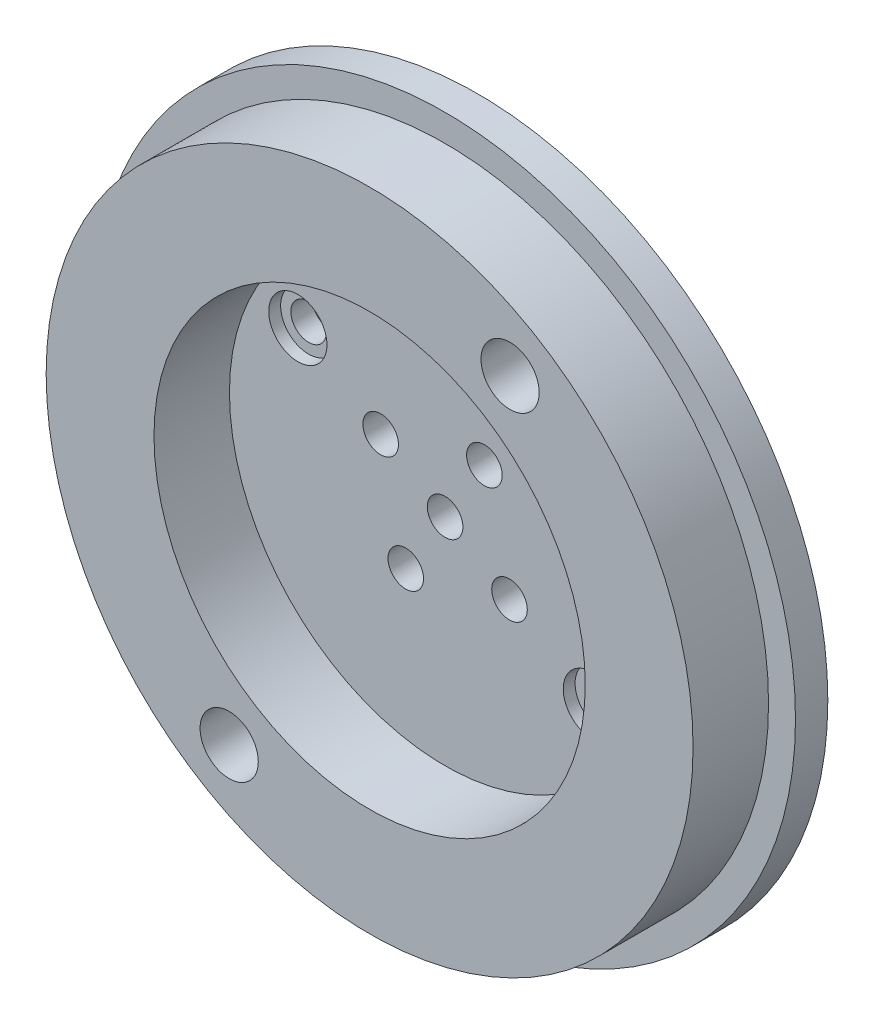
ISO-10303-21;
HEADER;
FILE_DESCRIPTION(('STEP AP214'),'2;1');
FILE_NAME('part.step','',(''),(''),'','','');
FILE_SCHEMA(('AUTOMOTIVE_DESIGN { 1 0 10303 214 1 1 1 1 }'));
ENDSEC;
DATA;
#1=APPLICATION_CONTEXT('core data for automotive mechanical design processes');
#2=APPLICATION_PROTOCOL_DEFINITION('international standard','automotive_design',2000,#1);
#3=PRODUCT_CONTEXT('',#1,'mechanical');
#4=PRODUCT('Part','Part','',(#3));
#5=PRODUCT_RELATED_PRODUCT_CATEGORY('part','',(#4));
#6=PRODUCT_DEFINITION_FORMATION('','',#4);
#7=PRODUCT_DEFINITION_CONTEXT('part definition',#1,'design');
#8=PRODUCT_DEFINITION('design','',#6,#7);
#9=PRODUCT_DEFINITION_SHAPE('','',#8);
#10=(LENGTH_UNIT() NAMED_UNIT(*) SI_UNIT(.MILLI.,.METRE.));
#11=(NAMED_UNIT(*) PLANE_ANGLE_UNIT() SI_UNIT($,.RADIAN.));
#12=(NAMED_UNIT(*) SI_UNIT($,.STERADIAN.) SOLID_ANGLE_UNIT());
#13=UNCERTAINTY_MEASURE_WITH_UNIT(LENGTH_MEASURE(1.E-05),#10,'distance_accuracy_value','');
#14=(GEOMETRIC_REPRESENTATION_CONTEXT(3) GLOBAL_UNCERTAINTY_ASSIGNED_CONTEXT((#13)) GLOBAL_UNIT_ASSIGNED_CONTEXT((#10,
#11,#12)) REPRESENTATION_CONTEXT('',''));
#15=CARTESIAN_POINT('',(0.,0.,0.));
#16=DIRECTION('',(0.,0.,1.));
#17=DIRECTION('',(1.,0.,0.));
#18=AXIS2_PLACEMENT_3D('',#15,#16,#17);
#19=CARTESIAN_POINT('',(-13.656264528531,8.33705218448303,2.));
#20=DIRECTION('',(0.,0.,-1.));
#21=DIRECTION('',(-1.,0.,0.));
#22=AXIS2_PLACEMENT_3D('',#19,#20,#21);
#23=CYLINDRICAL_SURFACE('',#22,2.6);
#24=CARTESIAN_POINT('',(-13.656264528531,8.33705218448303,2.));
#25=DIRECTION('',(0.,0.,-1.));
#26=DIRECTION('',(-1.,0.,0.));
#27=AXIS2_PLACEMENT_3D('',#24,#25,#26);
#28=CIRCLE('',#27,2.6);
#29=CARTESIAN_POINT('',(-16.256264528531,8.33705218448303,2.));
#30=VERTEX_POINT('',#29);
#31=EDGE_CURVE('E61',#30,#30,#28,.T.);
#32=ORIENTED_EDGE('',*,*,#31,.T.);
#33=EDGE_LOOP('',(#32));
#34=FACE_BOUND('',#33,.T.);
#35=CARTESIAN_POINT('',(-13.656264528531,8.33705218448303,0.));
#36=DIRECTION('',(0.,0.,-1.));
#37=DIRECTION('',(-1.,0.,0.));
#38=AXIS2_PLACEMENT_3D('',#35,#36,#37);
#39=CIRCLE('',#38,2.6);
#40=CARTESIAN_POINT('',(-16.256264528531,8.33705218448303,0.));
#41=VERTEX_POINT('',#40);
#42=EDGE_CURVE('E59',#41,#41,#39,.T.);
#43=ORIENTED_EDGE('',*,*,#42,.F.);
#44=EDGE_LOOP('',(#43));
#45=FACE_BOUND('',#44,.T.);
#46=ADVANCED_FACE('F48',(#34,#45),#23,.T.);
#47=CARTESIAN_POINT('',(-13.656264528531,8.33705218448303,2.));
#48=DIRECTION('',(0.,0.,-1.));
#49=DIRECTION('',(-1.,0.,0.));
#50=AXIS2_PLACEMENT_3D('',#47,#48,#49);
#51=PLANE('',#50);
#52=CARTESIAN_POINT('',(-13.656264528531,8.33705218448303,2.));
#53=DIRECTION('',(0.,0.,-1.));
#54=DIRECTION('',(-1.,0.,0.));
#55=AXIS2_PLACEMENT_3D('',#52,#53,#54);
#56=CIRCLE('',#55,1.65000000000001);
#57=CARTESIAN_POINT('',(-15.3062645285311,8.33705218448303,2.));
#58=VERTEX_POINT('',#57);
#59=EDGE_CURVE('E52',#58,#58,#56,.T.);
#60=ORIENTED_EDGE('',*,*,#59,.T.);
#61=EDGE_LOOP('',(#60));
#62=FACE_BOUND('',#61,.T.);
#63=ORIENTED_EDGE('',*,*,#31,.F.);
#64=EDGE_LOOP('',(#63));
#65=FACE_BOUND('',#64,.T.);
#66=ADVANCED_FACE('F70',(#62,#65),#51,.F.);
#67=CARTESIAN_POINT('',(-13.656264528531,8.33705218448303,0.));
#68=DIRECTION('',(0.,0.,-1.));
#69=DIRECTION('',(-1.,0.,0.));
#70=AXIS2_PLACEMENT_3D('',#67,#68,#69);
#71=PLANE('',#70);
#72=CARTESIAN_POINT('',(-13.656264528531,8.33705218448303,0.));
#73=DIRECTION('',(0.,0.,-1.));
#74=DIRECTION('',(-1.,0.,0.));
#75=AXIS2_PLACEMENT_3D('',#72,#73,#74);
#76=CIRCLE('',#75,1.65000000000001);
#77=CARTESIAN_POINT('',(-15.3062645285311,8.33705218448303,0.));
#78=VERTEX_POINT('',#77);
#79=EDGE_CURVE('E11',#78,#78,#76,.T.);
#80=ORIENTED_EDGE('',*,*,#79,.F.);
#81=EDGE_LOOP('',(#80));
#82=FACE_BOUND('',#81,.T.);
#83=ORIENTED_EDGE('',*,*,#42,.T.);
#84=EDGE_LOOP('',(#83));
#85=FACE_BOUND('',#84,.T.);
#86=ADVANCED_FACE('F67',(#82,#85),#71,.T.);
#87=CARTESIAN_POINT('',(-13.656264528531,8.33705218448303,2.));
#88=DIRECTION('',(0.,0.,-1.));
#89=DIRECTION('',(-1.,0.,0.));
#90=AXIS2_PLACEMENT_3D('',#87,#88,#89);
#91=CYLINDRICAL_SURFACE('',#90,1.65000000000001);
#92=ORIENTED_EDGE('',*,*,#59,.F.);
#93=EDGE_LOOP('',(#92));
#94=FACE_BOUND('',#93,.T.);
#95=ORIENTED_EDGE('',*,*,#79,.T.);
#96=EDGE_LOOP('',(#95));
#97=FACE_BOUND('',#96,.T.);
#98=ADVANCED_FACE('F50',(#94,#97),#91,.F.);
#99=CLOSED_SHELL('',(#46,#66,#86,#98));
#100=MANIFOLD_SOLID_BREP('B2',#99);
#101=CARTESIAN_POINT('',(13.6562645285306,-8.33705218448268,2.));
#102=DIRECTION('',(0.,0.,-1.));
#103=DIRECTION('',(-1.,0.,0.));
#104=AXIS2_PLACEMENT_3D('',#101,#102,#103);
#105=CYLINDRICAL_SURFACE('',#104,2.6);
#106=CARTESIAN_POINT('',(13.6562645285306,-8.33705218448268,2.));
#107=DIRECTION('',(0.,0.,-1.));
#108=DIRECTION('',(-1.,0.,0.));
#109=AXIS2_PLACEMENT_3D('',#106,#107,#108);
#110=CIRCLE('',#109,2.6);
#111=CARTESIAN_POINT('',(11.0562645285306,-8.33705218448268,2.));
#112=VERTEX_POINT('',#111);
#113=EDGE_CURVE('E131',#112,#112,#110,.T.);
#114=ORIENTED_EDGE('',*,*,#113,.T.);
#115=EDGE_LOOP('',(#114));
#116=FACE_BOUND('',#115,.T.);
#117=CARTESIAN_POINT('',(13.6562645285306,-8.33705218448268,0.));
#118=DIRECTION('',(0.,0.,-1.));
#119=DIRECTION('',(-1.,0.,0.));
#120=AXIS2_PLACEMENT_3D('',#117,#118,#119);
#121=CIRCLE('',#120,2.6);
#122=CARTESIAN_POINT('',(11.0562645285306,-8.33705218448268,0.));
#123=VERTEX_POINT('',#122);
#124=EDGE_CURVE('E129',#123,#123,#121,.T.);
#125=ORIENTED_EDGE('',*,*,#124,.F.);
#126=EDGE_LOOP('',(#125));
#127=FACE_BOUND('',#126,.T.);
#128=ADVANCED_FACE('F118',(#116,#127),#105,.T.);
#129=CARTESIAN_POINT('',(13.6562645285306,-8.33705218448268,2.));
#130=DIRECTION('',(0.,0.,-1.));
#131=DIRECTION('',(-1.,0.,0.));
#132=AXIS2_PLACEMENT_3D('',#129,#130,#131);
#133=PLANE('',#132);
#134=CARTESIAN_POINT('',(13.6562645285306,-8.33705218448268,2.));
#135=DIRECTION('',(0.,0.,-1.));
#136=DIRECTION('',(-1.,0.,0.));
#137=AXIS2_PLACEMENT_3D('',#134,#135,#136);
#138=CIRCLE('',#137,1.65);
#139=CARTESIAN_POINT('',(12.0062645285306,-8.33705218448268,2.));
#140=VERTEX_POINT('',#139);
#141=EDGE_CURVE('E122',#140,#140,#138,.T.);
#142=ORIENTED_EDGE('',*,*,#141,.T.);
#143=EDGE_LOOP('',(#142));
#144=FACE_BOUND('',#143,.T.);
#145=ORIENTED_EDGE('',*,*,#113,.F.);
#146=EDGE_LOOP('',(#145));
#147=FACE_BOUND('',#146,.T.);
#148=ADVANCED_FACE('F140',(#144,#147),#133,.F.);
#149=CARTESIAN_POINT('',(13.6562645285306,-8.33705218448268,0.));
#150=DIRECTION('',(0.,0.,-1.));
#151=DIRECTION('',(-1.,0.,0.));
#152=AXIS2_PLACEMENT_3D('',#149,#150,#151);
#153=PLANE('',#152);
#154=CARTESIAN_POINT('',(13.6562645285306,-8.33705218448268,0.));
#155=DIRECTION('',(0.,0.,-1.));
#156=DIRECTION('',(-1.,0.,0.));
#157=AXIS2_PLACEMENT_3D('',#154,#155,#156);
#158=CIRCLE('',#157,1.65);
#159=CARTESIAN_POINT('',(12.0062645285306,-8.33705218448268,0.));
#160=VERTEX_POINT('',#159);
#161=EDGE_CURVE('E47',#160,#160,#158,.T.);
#162=ORIENTED_EDGE('',*,*,#161,.F.);
#163=EDGE_LOOP('',(#162));
#164=FACE_BOUND('',#163,.T.);
#165=ORIENTED_EDGE('',*,*,#124,.T.);
#166=EDGE_LOOP('',(#165));
#167=FACE_BOUND('',#166,.T.);
#168=ADVANCED_FACE('F137',(#164,#167),#153,.T.);
#169=CARTESIAN_POINT('',(13.6562645285306,-8.33705218448268,2.));
#170=DIRECTION('',(0.,0.,-1.));
#171=DIRECTION('',(-1.,0.,0.));
#172=AXIS2_PLACEMENT_3D('',#169,#170,#171);
#173=CYLINDRICAL_SURFACE('',#172,1.65);
#174=ORIENTED_EDGE('',*,*,#141,.F.);
#175=EDGE_LOOP('',(#174));
#176=FACE_BOUND('',#175,.T.);
#177=ORIENTED_EDGE('',*,*,#161,.T.);
#178=EDGE_LOOP('',(#177));
#179=FACE_BOUND('',#178,.T.);
#180=ADVANCED_FACE('F120',(#176,#179),#173,.F.);
#181=CLOSED_SHELL('',(#128,#148,#168,#180));
#182=MANIFOLD_SOLID_BREP('B6',#181);
#183=CARTESIAN_POINT('',(13.0255759573381,21.3361637871199,2.));
#184=DIRECTION('',(0.,0.,-1.));
#185=DIRECTION('',(-1.,0.,0.));
#186=AXIS2_PLACEMENT_3D('',#183,#184,#185);
#187=CYLINDRICAL_SURFACE('',#186,2.6);
#188=CARTESIAN_POINT('',(13.0255759573381,21.3361637871199,2.));
#189=DIRECTION('',(0.,0.,-1.));
#190=DIRECTION('',(-1.,0.,0.));
#191=AXIS2_PLACEMENT_3D('',#188,#189,#190);
#192=CIRCLE('',#191,2.6);
#193=CARTESIAN_POINT('',(10.4255759573381,21.3361637871199,2.));
#194=VERTEX_POINT('',#193);
#195=EDGE_CURVE('E201',#194,#194,#192,.T.);
#196=ORIENTED_EDGE('',*,*,#195,.T.);
#197=EDGE_LOOP('',(#196));
#198=FACE_BOUND('',#197,.T.);
#199=CARTESIAN_POINT('',(13.0255759573381,21.3361637871199,0.));
#200=DIRECTION('',(0.,0.,-1.));
#201=DIRECTION('',(-1.,0.,0.));
#202=AXIS2_PLACEMENT_3D('',#199,#200,#201);
#203=CIRCLE('',#202,2.6);
#204=CARTESIAN_POINT('',(10.4255759573381,21.3361637871199,0.));
#205=VERTEX_POINT('',#204);
#206=EDGE_CURVE('E199',#205,#205,#203,.T.);
#207=ORIENTED_EDGE('',*,*,#206,.F.);
#208=EDGE_LOOP('',(#207));
#209=FACE_BOUND('',#208,.T.);
#210=ADVANCED_FACE('F188',(#198,#209),#187,.T.);
#211=CARTESIAN_POINT('',(13.0255759573381,21.3361637871199,2.));
#212=DIRECTION('',(0.,0.,-1.));
#213=DIRECTION('',(-1.,0.,0.));
#214=AXIS2_PLACEMENT_3D('',#211,#212,#213);
#215=PLANE('',#214);
#216=CARTESIAN_POINT('',(13.0255759573381,21.3361637871199,2.));
#217=DIRECTION('',(0.,0.,-1.));
#218=DIRECTION('',(-1.,0.,0.));
#219=AXIS2_PLACEMENT_3D('',#216,#217,#218);
#220=CIRCLE('',#219,1.65);
#221=CARTESIAN_POINT('',(11.3755759573381,21.3361637871199,2.));
#222=VERTEX_POINT('',#221);
#223=EDGE_CURVE('E192',#222,#222,#220,.T.);
#224=ORIENTED_EDGE('',*,*,#223,.T.);
#225=EDGE_LOOP('',(#224));
#226=FACE_BOUND('',#225,.T.);
#227=ORIENTED_EDGE('',*,*,#195,.F.);
#228=EDGE_LOOP('',(#227));
#229=FACE_BOUND('',#228,.T.);
#230=ADVANCED_FACE('F210',(#226,#229),#215,.F.);
#231=CARTESIAN_POINT('',(13.0255759573381,21.3361637871199,0.));
#232=DIRECTION('',(0.,0.,-1.));
#233=DIRECTION('',(-1.,0.,0.));
#234=AXIS2_PLACEMENT_3D('',#231,#232,#233);
#235=PLANE('',#234);
#236=CARTESIAN_POINT('',(13.0255759573381,21.3361637871199,0.));
#237=DIRECTION('',(0.,0.,-1.));
#238=DIRECTION('',(-1.,0.,0.));
#239=AXIS2_PLACEMENT_3D('',#236,#237,#238);
#240=CIRCLE('',#239,1.65);
#241=CARTESIAN_POINT('',(11.3755759573381,21.3361637871199,0.));
#242=VERTEX_POINT('',#241);
#243=EDGE_CURVE('E117',#242,#242,#240,.T.);
#244=ORIENTED_EDGE('',*,*,#243,.F.);
#245=EDGE_LOOP('',(#244));
#246=FACE_BOUND('',#245,.T.);
#247=ORIENTED_EDGE('',*,*,#206,.T.);
#248=EDGE_LOOP('',(#247));
#249=FACE_BOUND('',#248,.T.);
#250=ADVANCED_FACE('F207',(#246,#249),#235,.T.);
#251=CARTESIAN_POINT('',(13.0255759573381,21.3361637871199,2.));
#252=DIRECTION('',(0.,0.,-1.));
#253=DIRECTION('',(-1.,0.,0.));
#254=AXIS2_PLACEMENT_3D('',#251,#252,#253);
#255=CYLINDRICAL_SURFACE('',#254,1.65);
#256=ORIENTED_EDGE('',*,*,#223,.F.);
#257=EDGE_LOOP('',(#256));
#258=FACE_BOUND('',#257,.T.);
#259=ORIENTED_EDGE('',*,*,#243,.T.);
#260=EDGE_LOOP('',(#259));
#261=FACE_BOUND('',#260,.T.);
#262=ADVANCED_FACE('F190',(#258,#261),#255,.F.);
#263=CLOSED_SHELL('',(#210,#230,#250,#262));
#264=MANIFOLD_SOLID_BREP('B42',#263);
#265=CARTESIAN_POINT('',(-13.0255759573389,-21.3361637871192,2.));
#266=DIRECTION('',(0.,0.,-1.));
#267=DIRECTION('',(-1.,0.,0.));
#268=AXIS2_PLACEMENT_3D('',#265,#266,#267);
#269=CYLINDRICAL_SURFACE('',#268,2.6);
#270=CARTESIAN_POINT('',(-13.0255759573389,-21.3361637871192,2.));
#271=DIRECTION('',(0.,0.,-1.));
#272=DIRECTION('',(-1.,0.,0.));
#273=AXIS2_PLACEMENT_3D('',#270,#271,#272);
#274=CIRCLE('',#273,2.6);
#275=CARTESIAN_POINT('',(-15.6255759573389,-21.3361637871192,2.));
#276=VERTEX_POINT('',#275);
#277=EDGE_CURVE('E187',#276,#276,#274,.T.);
#278=ORIENTED_EDGE('',*,*,#277,.T.);
#279=EDGE_LOOP('',(#278));
#280=FACE_BOUND('',#279,.T.);
#281=CARTESIAN_POINT('',(-13.0255759573389,-21.3361637871192,0.));
#282=DIRECTION('',(0.,0.,-1.));
#283=DIRECTION('',(-1.,0.,0.));
#284=AXIS2_PLACEMENT_3D('',#281,#282,#283);
#285=CIRCLE('',#284,2.6);
#286=CARTESIAN_POINT('',(-15.6255759573389,-21.3361637871192,0.));
#287=VERTEX_POINT('',#286);
#288=EDGE_CURVE('E260',#287,#287,#285,.T.);
#289=ORIENTED_EDGE('',*,*,#288,.F.);
#290=EDGE_LOOP('',(#289));
#291=FACE_BOUND('',#290,.T.);
#292=ADVANCED_FACE('F257',(#280,#291),#269,.T.);
#293=CARTESIAN_POINT('',(-13.0255759573389,-21.3361637871192,2.));
#294=DIRECTION('',(0.,0.,-1.));
#295=DIRECTION('',(-1.,0.,0.));
#296=AXIS2_PLACEMENT_3D('',#293,#294,#295);
#297=PLANE('',#296);
#298=CARTESIAN_POINT('',(-13.0255759573389,-21.3361637871192,2.));
#299=DIRECTION('',(0.,0.,-1.));
#300=DIRECTION('',(-1.,0.,0.));
#301=AXIS2_PLACEMENT_3D('',#298,#299,#300);
#302=CIRCLE('',#301,1.65);
#303=CARTESIAN_POINT('',(-14.6755759573389,-21.3361637871192,2.));
#304=VERTEX_POINT('',#303);
#305=EDGE_CURVE('E267',#304,#304,#302,.T.);
#306=ORIENTED_EDGE('',*,*,#305,.T.);
#307=EDGE_LOOP('',(#306));
#308=FACE_BOUND('',#307,.T.);
#309=ORIENTED_EDGE('',*,*,#277,.F.);
#310=EDGE_LOOP('',(#309));
#311=FACE_BOUND('',#310,.T.);
#312=ADVANCED_FACE('F275',(#308,#311),#297,.F.);
#313=CARTESIAN_POINT('',(-13.0255759573389,-21.3361637871192,0.));
#314=DIRECTION('',(0.,0.,-1.));
#315=DIRECTION('',(-1.,0.,0.));
#316=AXIS2_PLACEMENT_3D('',#313,#314,#315);
#317=PLANE('',#316);
#318=CARTESIAN_POINT('',(-13.0255759573389,-21.3361637871192,0.));
#319=DIRECTION('',(0.,0.,-1.));
#320=DIRECTION('',(-1.,0.,0.));
#321=AXIS2_PLACEMENT_3D('',#318,#319,#320);
#322=CIRCLE('',#321,1.65);
#323=CARTESIAN_POINT('',(-14.6755759573389,-21.3361637871192,0.));
#324=VERTEX_POINT('',#323);
#325=EDGE_CURVE('E269',#324,#324,#322,.T.);
#326=ORIENTED_EDGE('',*,*,#325,.F.);
#327=EDGE_LOOP('',(#326));
#328=FACE_BOUND('',#327,.T.);
#329=ORIENTED_EDGE('',*,*,#288,.T.);
#330=EDGE_LOOP('',(#329));
#331=FACE_BOUND('',#330,.T.);
#332=ADVANCED_FACE('F281',(#328,#331),#317,.T.);
#333=CARTESIAN_POINT('',(-13.0255759573389,-21.3361637871192,2.));
#334=DIRECTION('',(0.,0.,-1.));
#335=DIRECTION('',(-1.,0.,0.));
#336=AXIS2_PLACEMENT_3D('',#333,#334,#335);
#337=CYLINDRICAL_SURFACE('',#336,1.65);
#338=ORIENTED_EDGE('',*,*,#305,.F.);
#339=EDGE_LOOP('',(#338));
#340=FACE_BOUND('',#339,.T.);
#341=ORIENTED_EDGE('',*,*,#325,.T.);
#342=EDGE_LOOP('',(#341));
#343=FACE_BOUND('',#342,.T.);
#344=ADVANCED_FACE('F278',(#340,#343),#337,.F.);
#345=CLOSED_SHELL('',(#292,#312,#332,#344));
#346=MANIFOLD_SOLID_BREP('B112',#345);
#347=CARTESIAN_POINT('',(0.,0.,3.));
#348=DIRECTION('',(0.,0.,-1.));
#349=DIRECTION('',(-1.,0.,0.));
#350=AXIS2_PLACEMENT_3D('',#347,#348,#349);
#351=CYLINDRICAL_SURFACE('',#350,32.5);
#352=CARTESIAN_POINT('',(0.,0.,3.));
#353=DIRECTION('',(0.,0.,1.));
#354=DIRECTION('',(1.,0.,0.));
#355=AXIS2_PLACEMENT_3D('',#352,#353,#354);
#356=CIRCLE('',#355,32.5);
#357=CARTESIAN_POINT('',(32.5,0.,3.));
#358=VERTEX_POINT('',#357);
#359=EDGE_CURVE('E326',#358,#358,#356,.T.);
#360=ORIENTED_EDGE('',*,*,#359,.F.);
#361=EDGE_LOOP('',(#360));
#362=FACE_BOUND('',#361,.T.);
#363=CARTESIAN_POINT('',(0.,0.,0.));
#364=DIRECTION('',(0.,0.,1.));
#365=DIRECTION('',(1.,0.,0.));
#366=AXIS2_PLACEMENT_3D('',#363,#364,#365);
#367=CIRCLE('',#366,32.5);
#368=CARTESIAN_POINT('',(32.5,0.,0.));
#369=VERTEX_POINT('',#368);
#370=EDGE_CURVE('E331',#369,#369,#367,.T.);
#371=ORIENTED_EDGE('',*,*,#370,.T.);
#372=EDGE_LOOP('',(#371));
#373=FACE_BOUND('',#372,.T.);
#374=ADVANCED_FACE('F319',(#362,#373),#351,.T.);
#375=CARTESIAN_POINT('',(0.,0.,3.));
#376=DIRECTION('',(0.,0.,1.));
#377=DIRECTION('',(1.,0.,0.));
#378=AXIS2_PLACEMENT_3D('',#375,#376,#377);
#379=PLANE('',#378);
#380=CARTESIAN_POINT('',(0.,0.,3.));
#381=DIRECTION('',(0.,0.,1.));
#382=DIRECTION('',(1.,0.,0.));
#383=AXIS2_PLACEMENT_3D('',#380,#381,#382);
#384=CIRCLE('',#383,30.);
#385=CARTESIAN_POINT('',(30.,0.,3.));
#386=VERTEX_POINT('',#385);
#387=EDGE_CURVE('E256',#386,#386,#384,.T.);
#388=ORIENTED_EDGE('',*,*,#387,.F.);
#389=EDGE_LOOP('',(#388));
#390=FACE_BOUND('',#389,.T.);
#391=ORIENTED_EDGE('',*,*,#359,.T.);
#392=EDGE_LOOP('',(#391));
#393=FACE_BOUND('',#392,.T.);
#394=ADVANCED_FACE('F398',(#390,#393),#379,.T.);
#395=CARTESIAN_POINT('',(0.,0.,0.));
#396=DIRECTION('',(0.,0.,1.));
#397=DIRECTION('',(1.,0.,0.));
#398=AXIS2_PLACEMENT_3D('',#395,#396,#397);
#399=PLANE('',#398);
#400=CARTESIAN_POINT('',(3.64746033071129,5.97461573123222,0.));
#401=DIRECTION('',(0.,0.,-1.));
#402=DIRECTION('',(-1.,0.,0.));
#403=AXIS2_PLACEMENT_3D('',#400,#401,#402);
#404=CIRCLE('',#403,1.65);
#405=CARTESIAN_POINT('',(1.99746033071129,5.97461573123222,0.));
#406=VERTEX_POINT('',#405);
#407=EDGE_CURVE('E545',#406,#406,#404,.T.);
#408=ORIENTED_EDGE('',*,*,#407,.F.);
#409=EDGE_LOOP('',(#408));
#410=FACE_BOUND('',#409,.T.);
#411=CARTESIAN_POINT('',(5.97461573123222,-3.64746033071129,0.));
#412=DIRECTION('',(0.,0.,-1.));
#413=DIRECTION('',(-1.,0.,0.));
#414=AXIS2_PLACEMENT_3D('',#411,#412,#413);
#415=CIRCLE('',#414,1.65);
#416=CARTESIAN_POINT('',(4.32461573123222,-3.64746033071129,0.));
#417=VERTEX_POINT('',#416);
#418=EDGE_CURVE('E546',#417,#417,#415,.T.);
#419=ORIENTED_EDGE('',*,*,#418,.F.);
#420=EDGE_LOOP('',(#419));
#421=FACE_BOUND('',#420,.T.);
#422=CARTESIAN_POINT('',(-3.64746033071129,-5.97461573123222,0.));
#423=DIRECTION('',(0.,0.,-1.));
#424=DIRECTION('',(-1.,0.,0.));
#425=AXIS2_PLACEMENT_3D('',#422,#423,#424);
#426=CIRCLE('',#425,1.65000000000001);
#427=CARTESIAN_POINT('',(-5.29746033071129,-5.97461573123222,0.));
#428=VERTEX_POINT('',#427);
#429=EDGE_CURVE('E549',#428,#428,#426,.T.);
#430=ORIENTED_EDGE('',*,*,#429,.F.);
#431=EDGE_LOOP('',(#430));
#432=FACE_BOUND('',#431,.T.);
#433=CARTESIAN_POINT('',(-5.97461573123222,3.64746033071129,0.));
#434=DIRECTION('',(0.,0.,-1.));
#435=DIRECTION('',(-1.,0.,0.));
#436=AXIS2_PLACEMENT_3D('',#433,#434,#435);
#437=CIRCLE('',#436,1.65000000000001);
#438=CARTESIAN_POINT('',(-7.62461573123223,3.64746033071129,0.));
#439=VERTEX_POINT('',#438);
#440=EDGE_CURVE('E555',#439,#439,#437,.T.);
#441=ORIENTED_EDGE('',*,*,#440,.F.);
#442=EDGE_LOOP('',(#441));
#443=FACE_BOUND('',#442,.T.);
#444=CARTESIAN_POINT('',(0.,0.,0.));
#445=DIRECTION('',(0.,0.,-1.));
#446=DIRECTION('',(-1.,0.,0.));
#447=AXIS2_PLACEMENT_3D('',#444,#445,#446);
#448=CIRCLE('',#447,1.65);
#449=CARTESIAN_POINT('',(-1.65,0.,0.));
#450=VERTEX_POINT('',#449);
#451=EDGE_CURVE('E351',#450,#450,#448,.T.);
#452=ORIENTED_EDGE('',*,*,#451,.F.);
#453=EDGE_LOOP('',(#452));
#454=FACE_BOUND('',#453,.T.);
#455=CARTESIAN_POINT('',(-13.0255759573389,-21.3361637871192,0.));
#456=DIRECTION('',(0.,0.,1.));
#457=DIRECTION('',(1.,0.,0.));
#458=AXIS2_PLACEMENT_3D('',#455,#456,#457);
#459=CIRCLE('',#458,2.7);
#460=CARTESIAN_POINT('',(-10.3255759573389,-21.3361637871192,0.));
#461=VERTEX_POINT('',#460);
#462=EDGE_CURVE('E343',#461,#461,#459,.T.);
#463=ORIENTED_EDGE('',*,*,#462,.T.);
#464=EDGE_LOOP('',(#463));
#465=FACE_BOUND('',#464,.T.);
#466=CARTESIAN_POINT('',(13.0255759573381,21.3361637871199,0.));
#467=DIRECTION('',(0.,0.,1.));
#468=DIRECTION('',(1.,0.,0.));
#469=AXIS2_PLACEMENT_3D('',#466,#467,#468);
#470=CIRCLE('',#469,2.7);
#471=CARTESIAN_POINT('',(15.7255759573381,21.3361637871199,0.));
#472=VERTEX_POINT('',#471);
#473=EDGE_CURVE('E370',#472,#472,#470,.T.);
#474=ORIENTED_EDGE('',*,*,#473,.T.);
#475=EDGE_LOOP('',(#474));
#476=FACE_BOUND('',#475,.T.);
#477=CARTESIAN_POINT('',(13.6562645285306,-8.33705218448268,0.));
#478=DIRECTION('',(0.,0.,1.));
#479=DIRECTION('',(1.,0.,0.));
#480=AXIS2_PLACEMENT_3D('',#477,#478,#479);
#481=CIRCLE('',#480,2.69999999999999);
#482=CARTESIAN_POINT('',(16.3562645285306,-8.33705218448268,0.));
#483=VERTEX_POINT('',#482);
#484=EDGE_CURVE('E365',#483,#483,#481,.T.);
#485=ORIENTED_EDGE('',*,*,#484,.T.);
#486=EDGE_LOOP('',(#485));
#487=FACE_BOUND('',#486,.T.);
#488=CARTESIAN_POINT('',(-13.656264528531,8.33705218448303,0.));
#489=DIRECTION('',(0.,0.,1.));
#490=DIRECTION('',(1.,0.,0.));
#491=AXIS2_PLACEMENT_3D('',#488,#489,#490);
#492=CIRCLE('',#491,2.7);
#493=CARTESIAN_POINT('',(-10.956264528531,8.33705218448303,0.));
#494=VERTEX_POINT('',#493);
#495=EDGE_CURVE('E361',#494,#494,#492,.T.);
#496=ORIENTED_EDGE('',*,*,#495,.T.);
#497=EDGE_LOOP('',(#496));
#498=FACE_BOUND('',#497,.T.);
#499=ORIENTED_EDGE('',*,*,#370,.F.);
#500=EDGE_LOOP('',(#499));
#501=FACE_BOUND('',#500,.T.);
#502=ADVANCED_FACE('F391',(#410,#421,#432,#443,#454,#465,#476,#487,#498,#501),#399,.F.);
#503=CARTESIAN_POINT('',(0.,0.,10.));
#504=DIRECTION('',(0.,0.,-1.));
#505=DIRECTION('',(-1.,0.,0.));
#506=AXIS2_PLACEMENT_3D('',#503,#504,#505);
#507=CYLINDRICAL_SURFACE('',#506,30.);
#508=CARTESIAN_POINT('',(0.,0.,10.));
#509=DIRECTION('',(0.,0.,1.));
#510=DIRECTION('',(1.,0.,0.));
#511=AXIS2_PLACEMENT_3D('',#508,#509,#510);
#512=CIRCLE('',#511,30.);
#513=CARTESIAN_POINT('',(30.,0.,10.));
#514=VERTEX_POINT('',#513);
#515=EDGE_CURVE('E334',#514,#514,#512,.T.);
#516=ORIENTED_EDGE('',*,*,#515,.F.);
#517=EDGE_LOOP('',(#516));
#518=FACE_BOUND('',#517,.T.);
#519=ORIENTED_EDGE('',*,*,#387,.T.);
#520=EDGE_LOOP('',(#519));
#521=FACE_BOUND('',#520,.T.);
#522=ADVANCED_FACE('F384',(#518,#521),#507,.T.);
#523=CARTESIAN_POINT('',(0.,0.,10.));
#524=DIRECTION('',(0.,0.,1.));
#525=DIRECTION('',(1.,0.,0.));
#526=AXIS2_PLACEMENT_3D('',#523,#524,#525);
#527=PLANE('',#526);
#528=CARTESIAN_POINT('',(-13.0255759573389,-21.3361637871192,10.));
#529=DIRECTION('',(0.,0.,1.));
#530=DIRECTION('',(1.,0.,0.));
#531=AXIS2_PLACEMENT_3D('',#528,#529,#530);
#532=CIRCLE('',#531,2.7);
#533=CARTESIAN_POINT('',(-10.3255759573389,-21.3361637871192,10.));
#534=VERTEX_POINT('',#533);
#535=EDGE_CURVE('E558',#534,#534,#532,.T.);
#536=ORIENTED_EDGE('',*,*,#535,.F.);
#537=EDGE_LOOP('',(#536));
#538=FACE_BOUND('',#537,.T.);
#539=CARTESIAN_POINT('',(13.0255759573381,21.3361637871199,10.));
#540=DIRECTION('',(0.,0.,1.));
#541=DIRECTION('',(1.,0.,0.));
#542=AXIS2_PLACEMENT_3D('',#539,#540,#541);
#543=CIRCLE('',#542,2.7);
#544=CARTESIAN_POINT('',(15.7255759573381,21.3361637871199,10.));
#545=VERTEX_POINT('',#544);
#546=EDGE_CURVE('E561',#545,#545,#543,.T.);
#547=ORIENTED_EDGE('',*,*,#546,.F.);
#548=EDGE_LOOP('',(#547));
#549=FACE_BOUND('',#548,.T.);
#550=CARTESIAN_POINT('',(0.,0.,10.));
#551=DIRECTION('',(0.,0.,1.));
#552=DIRECTION('',(1.,0.,0.));
#553=AXIS2_PLACEMENT_3D('',#550,#551,#552);
#554=CIRCLE('',#553,20.);
#555=CARTESIAN_POINT('',(20.,0.,10.));
#556=VERTEX_POINT('',#555);
#557=EDGE_CURVE('E346',#556,#556,#554,.T.);
#558=ORIENTED_EDGE('',*,*,#557,.F.);
#559=EDGE_LOOP('',(#558));
#560=FACE_BOUND('',#559,.T.);
#561=ORIENTED_EDGE('',*,*,#515,.T.);
#562=EDGE_LOOP('',(#561));
#563=FACE_BOUND('',#562,.T.);
#564=ADVANCED_FACE('F381',(#538,#549,#560,#563),#527,.T.);
#565=CARTESIAN_POINT('',(0.,0.,3.));
#566=DIRECTION('',(0.,0.,1.));
#567=DIRECTION('',(1.,0.,0.));
#568=AXIS2_PLACEMENT_3D('',#565,#566,#567);
#569=CYLINDRICAL_SURFACE('',#568,20.);
#570=CARTESIAN_POINT('',(0.,0.,3.));
#571=DIRECTION('',(0.,0.,1.));
#572=DIRECTION('',(1.,0.,0.));
#573=AXIS2_PLACEMENT_3D('',#570,#571,#572);
#574=CIRCLE('',#573,20.);
#575=CARTESIAN_POINT('',(20.,0.,3.));
#576=VERTEX_POINT('',#575);
#577=EDGE_CURVE('E374',#576,#576,#574,.T.);
#578=ORIENTED_EDGE('',*,*,#577,.F.);
#579=EDGE_LOOP('',(#578));
#580=FACE_BOUND('',#579,.T.);
#581=ORIENTED_EDGE('',*,*,#557,.T.);
#582=EDGE_LOOP('',(#581));
#583=FACE_BOUND('',#582,.T.);
#584=ADVANCED_FACE('F379',(#580,#583),#569,.F.);
#585=CARTESIAN_POINT('',(0.,0.,3.));
#586=DIRECTION('',(0.,0.,1.));
#587=DIRECTION('',(1.,0.,0.));
#588=AXIS2_PLACEMENT_3D('',#585,#586,#587);
#589=PLANE('',#588);
#590=CARTESIAN_POINT('',(3.64746033071129,5.97461573123222,3.));
#591=DIRECTION('',(0.,0.,1.));
#592=DIRECTION('',(1.,0.,0.));
#593=AXIS2_PLACEMENT_3D('',#590,#591,#592);
#594=CIRCLE('',#593,1.65);
#595=CARTESIAN_POINT('',(5.29746033071129,5.97461573123222,3.));
#596=VERTEX_POINT('',#595);
#597=EDGE_CURVE('E322',#596,#596,#594,.T.);
#598=ORIENTED_EDGE('',*,*,#597,.F.);
#599=EDGE_LOOP('',(#598));
#600=FACE_BOUND('',#599,.T.);
#601=CARTESIAN_POINT('',(5.97461573123222,-3.64746033071129,3.));
#602=DIRECTION('',(0.,0.,1.));
#603=DIRECTION('',(1.,0.,0.));
#604=AXIS2_PLACEMENT_3D('',#601,#602,#603);
#605=CIRCLE('',#604,1.65);
#606=CARTESIAN_POINT('',(7.62461573123222,-3.64746033071129,3.));
#607=VERTEX_POINT('',#606);
#608=EDGE_CURVE('E356',#607,#607,#605,.T.);
#609=ORIENTED_EDGE('',*,*,#608,.F.);
#610=EDGE_LOOP('',(#609));
#611=FACE_BOUND('',#610,.T.);
#612=CARTESIAN_POINT('',(-3.64746033071129,-5.97461573123222,3.));
#613=DIRECTION('',(0.,0.,1.));
#614=DIRECTION('',(1.,0.,0.));
#615=AXIS2_PLACEMENT_3D('',#612,#613,#614);
#616=CIRCLE('',#615,1.65000000000001);
#617=CARTESIAN_POINT('',(-1.99746033071128,-5.97461573123222,3.));
#618=VERTEX_POINT('',#617);
#619=EDGE_CURVE('E354',#618,#618,#616,.T.);
#620=ORIENTED_EDGE('',*,*,#619,.F.);
#621=EDGE_LOOP('',(#620));
#622=FACE_BOUND('',#621,.T.);
#623=CARTESIAN_POINT('',(-5.97461573123222,3.64746033071129,3.));
#624=DIRECTION('',(0.,0.,1.));
#625=DIRECTION('',(1.,0.,0.));
#626=AXIS2_PLACEMENT_3D('',#623,#624,#625);
#627=CIRCLE('',#626,1.65000000000001);
#628=CARTESIAN_POINT('',(-4.32461573123221,3.64746033071129,3.));
#629=VERTEX_POINT('',#628);
#630=EDGE_CURVE('E350',#629,#629,#627,.T.);
#631=ORIENTED_EDGE('',*,*,#630,.F.);
#632=EDGE_LOOP('',(#631));
#633=FACE_BOUND('',#632,.T.);
#634=CARTESIAN_POINT('',(0.,0.,3.));
#635=DIRECTION('',(0.,0.,1.));
#636=DIRECTION('',(1.,0.,0.));
#637=AXIS2_PLACEMENT_3D('',#634,#635,#636);
#638=CIRCLE('',#637,1.65);
#639=CARTESIAN_POINT('',(1.65,0.,3.));
#640=VERTEX_POINT('',#639);
#641=EDGE_CURVE('E347',#640,#640,#638,.T.);
#642=ORIENTED_EDGE('',*,*,#641,.F.);
#643=EDGE_LOOP('',(#642));
#644=FACE_BOUND('',#643,.T.);
#645=CARTESIAN_POINT('',(13.6562645285306,-8.33705218448268,3.));
#646=DIRECTION('',(0.,0.,1.));
#647=DIRECTION('',(1.,0.,0.));
#648=AXIS2_PLACEMENT_3D('',#645,#646,#647);
#649=CIRCLE('',#648,2.69999999999999);
#650=CARTESIAN_POINT('',(16.3562645285306,-8.33705218448268,3.));
#651=VERTEX_POINT('',#650);
#652=EDGE_CURVE('E342',#651,#651,#649,.T.);
#653=ORIENTED_EDGE('',*,*,#652,.F.);
#654=EDGE_LOOP('',(#653));
#655=FACE_BOUND('',#654,.T.);
#656=CARTESIAN_POINT('',(-13.656264528531,8.33705218448303,3.));
#657=DIRECTION('',(0.,0.,1.));
#658=DIRECTION('',(1.,0.,0.));
#659=AXIS2_PLACEMENT_3D('',#656,#657,#658);
#660=CIRCLE('',#659,2.7);
#661=CARTESIAN_POINT('',(-10.956264528531,8.33705218448303,3.));
#662=VERTEX_POINT('',#661);
#663=EDGE_CURVE('E339',#662,#662,#660,.T.);
#664=ORIENTED_EDGE('',*,*,#663,.F.);
#665=EDGE_LOOP('',(#664));
#666=FACE_BOUND('',#665,.T.);
#667=ORIENTED_EDGE('',*,*,#577,.T.);
#668=EDGE_LOOP('',(#667));
#669=FACE_BOUND('',#668,.T.);
#670=ADVANCED_FACE('F444',(#600,#611,#622,#633,#644,#655,#666,#669),#589,.T.);
#671=CARTESIAN_POINT('',(-13.656264528531,8.33705218448303,0.));
#672=DIRECTION('',(0.,0.,1.));
#673=DIRECTION('',(1.,0.,0.));
#674=AXIS2_PLACEMENT_3D('',#671,#672,#673);
#675=CYLINDRICAL_SURFACE('',#674,2.7);
#676=ORIENTED_EDGE('',*,*,#663,.T.);
#677=EDGE_LOOP('',(#676));
#678=FACE_BOUND('',#677,.T.);
#679=ORIENTED_EDGE('',*,*,#495,.F.);
#680=EDGE_LOOP('',(#679));
#681=FACE_BOUND('',#680,.T.);
#682=ADVANCED_FACE('F453',(#678,#681),#675,.F.);
#683=CARTESIAN_POINT('',(13.6562645285306,-8.33705218448268,0.));
#684=DIRECTION('',(0.,0.,1.));
#685=DIRECTION('',(1.,0.,0.));
#686=AXIS2_PLACEMENT_3D('',#683,#684,#685);
#687=CYLINDRICAL_SURFACE('',#686,2.69999999999999);
#688=ORIENTED_EDGE('',*,*,#652,.T.);
#689=EDGE_LOOP('',(#688));
#690=FACE_BOUND('',#689,.T.);
#691=ORIENTED_EDGE('',*,*,#484,.F.);
#692=EDGE_LOOP('',(#691));
#693=FACE_BOUND('',#692,.T.);
#694=ADVANCED_FACE('F463',(#690,#693),#687,.F.);
#695=CARTESIAN_POINT('',(13.0255759573381,21.3361637871199,0.));
#696=DIRECTION('',(0.,0.,1.));
#697=DIRECTION('',(1.,0.,0.));
#698=AXIS2_PLACEMENT_3D('',#695,#696,#697);
#699=CYLINDRICAL_SURFACE('',#698,2.7);
#700=ORIENTED_EDGE('',*,*,#473,.F.);
#701=EDGE_LOOP('',(#700));
#702=FACE_BOUND('',#701,.T.);
#703=ORIENTED_EDGE('',*,*,#546,.T.);
#704=EDGE_LOOP('',(#703));
#705=FACE_BOUND('',#704,.T.);
#706=ADVANCED_FACE('F473',(#702,#705),#699,.F.);
#707=CARTESIAN_POINT('',(-13.0255759573389,-21.3361637871192,0.));
#708=DIRECTION('',(0.,0.,1.));
#709=DIRECTION('',(1.,0.,0.));
#710=AXIS2_PLACEMENT_3D('',#707,#708,#709);
#711=CYLINDRICAL_SURFACE('',#710,2.7);
#712=ORIENTED_EDGE('',*,*,#462,.F.);
#713=EDGE_LOOP('',(#712));
#714=FACE_BOUND('',#713,.T.);
#715=ORIENTED_EDGE('',*,*,#535,.T.);
#716=EDGE_LOOP('',(#715));
#717=FACE_BOUND('',#716,.T.);
#718=ADVANCED_FACE('F483',(#714,#717),#711,.F.);
#719=CARTESIAN_POINT('',(0.,0.,10.));
#720=DIRECTION('',(0.,0.,-1.));
#721=DIRECTION('',(-1.,0.,0.));
#722=AXIS2_PLACEMENT_3D('',#719,#720,#721);
#723=CYLINDRICAL_SURFACE('',#722,1.65);
#724=ORIENTED_EDGE('',*,*,#641,.T.);
#725=EDGE_LOOP('',(#724));
#726=FACE_BOUND('',#725,.T.);
#727=ORIENTED_EDGE('',*,*,#451,.T.);
#728=EDGE_LOOP('',(#727));
#729=FACE_BOUND('',#728,.T.);
#730=ADVANCED_FACE('F492',(#726,#729),#723,.F.);
#731=CARTESIAN_POINT('',(-5.97461573123222,3.64746033071129,10.));
#732=DIRECTION('',(0.,0.,-1.));
#733=DIRECTION('',(-1.,0.,0.));
#734=AXIS2_PLACEMENT_3D('',#731,#732,#733);
#735=CYLINDRICAL_SURFACE('',#734,1.65000000000001);
#736=ORIENTED_EDGE('',*,*,#630,.T.);
#737=EDGE_LOOP('',(#736));
#738=FACE_BOUND('',#737,.T.);
#739=ORIENTED_EDGE('',*,*,#440,.T.);
#740=EDGE_LOOP('',(#739));
#741=FACE_BOUND('',#740,.T.);
#742=ADVANCED_FACE('F501',(#738,#741),#735,.F.);
#743=CARTESIAN_POINT('',(-3.64746033071129,-5.97461573123222,10.));
#744=DIRECTION('',(0.,0.,-1.));
#745=DIRECTION('',(-1.,0.,0.));
#746=AXIS2_PLACEMENT_3D('',#743,#744,#745);
#747=CYLINDRICAL_SURFACE('',#746,1.65000000000001);
#748=ORIENTED_EDGE('',*,*,#619,.T.);
#749=EDGE_LOOP('',(#748));
#750=FACE_BOUND('',#749,.T.);
#751=ORIENTED_EDGE('',*,*,#429,.T.);
#752=EDGE_LOOP('',(#751));
#753=FACE_BOUND('',#752,.T.);
#754=ADVANCED_FACE('F511',(#750,#753),#747,.F.);
#755=CARTESIAN_POINT('',(5.97461573123222,-3.64746033071129,10.));
#756=DIRECTION('',(0.,0.,-1.));
#757=DIRECTION('',(-1.,0.,0.));
#758=AXIS2_PLACEMENT_3D('',#755,#756,#757);
#759=CYLINDRICAL_SURFACE('',#758,1.65);
#760=ORIENTED_EDGE('',*,*,#608,.T.);
#761=EDGE_LOOP('',(#760));
#762=FACE_BOUND('',#761,.T.);
#763=ORIENTED_EDGE('',*,*,#418,.T.);
#764=EDGE_LOOP('',(#763));
#765=FACE_BOUND('',#764,.T.);
#766=ADVANCED_FACE('F521',(#762,#765),#759,.F.);
#767=CARTESIAN_POINT('',(3.64746033071129,5.97461573123222,10.));
#768=DIRECTION('',(0.,0.,-1.));
#769=DIRECTION('',(-1.,0.,0.));
#770=AXIS2_PLACEMENT_3D('',#767,#768,#769);
#771=CYLINDRICAL_SURFACE('',#770,1.65);
#772=ORIENTED_EDGE('',*,*,#597,.T.);
#773=EDGE_LOOP('',(#772));
#774=FACE_BOUND('',#773,.T.);
#775=ORIENTED_EDGE('',*,*,#407,.T.);
#776=EDGE_LOOP('',(#775));
#777=FACE_BOUND('',#776,.T.);
#778=ADVANCED_FACE('F531',(#774,#777),#771,.F.);
#779=CLOSED_SHELL('',(#374,#394,#502,#522,#564,#584,#670,#682,#694,#706,#718,#730,#742,#754,
#766,#778));
#780=MANIFOLD_SOLID_BREP('B182',#779);
#781=ADVANCED_BREP_SHAPE_REPRESENTATION('',(#18,#100,#182,#264,#346,#780),#14);
#782=SHAPE_DEFINITION_REPRESENTATION(#9,#781);
ENDSEC;
END-ISO-10303-21;
